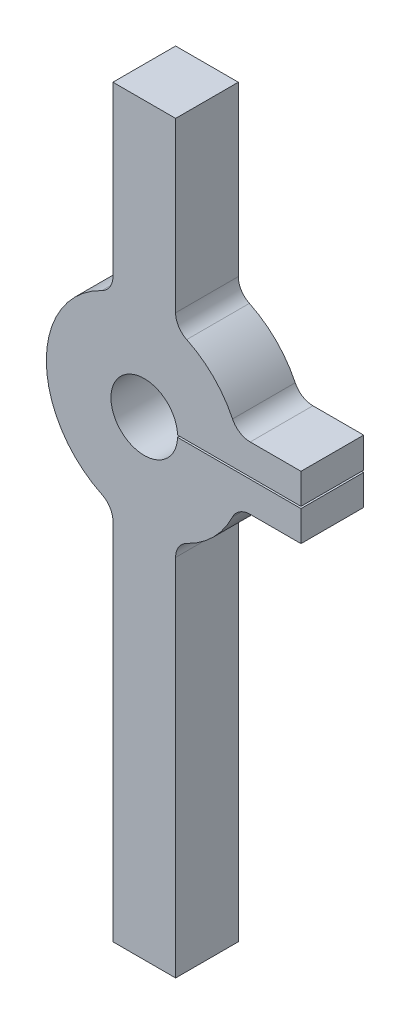
ISO-10303-21;
HEADER;
FILE_DESCRIPTION(('STEP AP214'),'2;1');
FILE_NAME('part.step','',(''),(''),'','','');
FILE_SCHEMA(('AUTOMOTIVE_DESIGN { 1 0 10303 214 1 1 1 1 }'));
ENDSEC;
DATA;
#1=APPLICATION_CONTEXT('core data for automotive mechanical design processes');
#2=APPLICATION_PROTOCOL_DEFINITION('international standard','automotive_design',2000,#1);
#3=PRODUCT_CONTEXT('',#1,'mechanical');
#4=PRODUCT('Part','Part','',(#3));
#5=PRODUCT_RELATED_PRODUCT_CATEGORY('part','',(#4));
#6=PRODUCT_DEFINITION_FORMATION('','',#4);
#7=PRODUCT_DEFINITION_CONTEXT('part definition',#1,'design');
#8=PRODUCT_DEFINITION('design','',#6,#7);
#9=PRODUCT_DEFINITION_SHAPE('','',#8);
#10=(LENGTH_UNIT() NAMED_UNIT(*) SI_UNIT(.MILLI.,.METRE.));
#11=(NAMED_UNIT(*) PLANE_ANGLE_UNIT() SI_UNIT($,.RADIAN.));
#12=(NAMED_UNIT(*) SI_UNIT($,.STERADIAN.) SOLID_ANGLE_UNIT());
#13=UNCERTAINTY_MEASURE_WITH_UNIT(LENGTH_MEASURE(1.E-05),#10,'distance_accuracy_value','');
#14=(GEOMETRIC_REPRESENTATION_CONTEXT(3) GLOBAL_UNCERTAINTY_ASSIGNED_CONTEXT((#13)) GLOBAL_UNIT_ASSIGNED_CONTEXT((#10,
#11,#12)) REPRESENTATION_CONTEXT('',''));
#15=CARTESIAN_POINT('',(0.,0.,0.));
#16=DIRECTION('',(0.,0.,1.));
#17=DIRECTION('',(1.,0.,0.));
#18=AXIS2_PLACEMENT_3D('',#15,#16,#17);
#19=CARTESIAN_POINT('',(0.,0.,-8.));
#20=DIRECTION('',(0.,0.,1.));
#21=DIRECTION('',(1.,0.,0.));
#22=AXIS2_PLACEMENT_3D('',#19,#20,#21);
#23=PLANE('',#22);
#24=CARTESIAN_POINT('',(0.,0.,-8.));
#25=DIRECTION('',(0.,0.,1.));
#26=DIRECTION('',(1.,0.,0.));
#27=AXIS2_PLACEMENT_3D('',#24,#25,#26);
#28=CIRCLE('',#27,14.);
#29=CARTESIAN_POINT('',(13.9977676791694,0.25,-8.));
#30=VERTEX_POINT('',#29);
#31=CARTESIAN_POINT('',(13.9977676791694,-0.25,-8.));
#32=VERTEX_POINT('',#31);
#33=EDGE_CURVE('E47',#30,#32,#28,.T.);
#34=ORIENTED_EDGE('',*,*,#33,.T.);
#35=DIRECTION('',(1.,0.,0.));
#36=VECTOR('',#35,1.);
#37=CARTESIAN_POINT('',(2.,-0.25,-8.));
#38=LINE('',#37,#36);
#39=CARTESIAN_POINT('',(40.,-0.25,-8.));
#40=VERTEX_POINT('',#39);
#41=EDGE_CURVE('E205',#32,#40,#38,.T.);
#42=ORIENTED_EDGE('',*,*,#41,.T.);
#43=DIRECTION('',(0.,1.,0.));
#44=VECTOR('',#43,1.);
#45=CARTESIAN_POINT('',(40.,-8.,-8.));
#46=LINE('',#45,#44);
#47=CARTESIAN_POINT('',(40.,-8.,-8.));
#48=VERTEX_POINT('',#47);
#49=EDGE_CURVE('E238',#48,#40,#46,.T.);
#50=ORIENTED_EDGE('',*,*,#49,.F.);
#51=DIRECTION('',(1.,0.,0.));
#52=VECTOR('',#51,1.);
#53=CARTESIAN_POINT('',(40.,-8.,-8.));
#54=LINE('',#53,#52);
#55=CARTESIAN_POINT('',(27.0370116691916,-8.,-8.));
#56=VERTEX_POINT('',#55);
#57=EDGE_CURVE('E224',#56,#48,#54,.T.);
#58=ORIENTED_EDGE('',*,*,#57,.F.);
#59=CARTESIAN_POINT('',(27.0370116691916,-13.,-8.));
#60=DIRECTION('',(0.,0.,1.));
#61=DIRECTION('',(1.,0.,0.));
#62=AXIS2_PLACEMENT_3D('',#59,#60,#61);
#63=CIRCLE('',#62,5.);
#64=CARTESIAN_POINT('',(22.5308430576596,-10.8333333333333,-8.));
#65=VERTEX_POINT('',#64);
#66=EDGE_CURVE('E333',#56,#65,#63,.T.);
#67=ORIENTED_EDGE('',*,*,#66,.T.);
#68=CARTESIAN_POINT('',(0.,0.,-8.));
#69=DIRECTION('',(0.,0.,1.));
#70=DIRECTION('',(1.,0.,0.));
#71=AXIS2_PLACEMENT_3D('',#68,#69,#70);
#72=CIRCLE('',#71,25.);
#73=CARTESIAN_POINT('',(10.8333333333333,-22.5308430576596,-8.));
#74=VERTEX_POINT('',#73);
#75=EDGE_CURVE('E298',#74,#65,#72,.T.);
#76=ORIENTED_EDGE('',*,*,#75,.F.);
#77=CARTESIAN_POINT('',(13.,-27.0370116691916,-8.));
#78=DIRECTION('',(0.,0.,1.));
#79=DIRECTION('',(1.,0.,0.));
#80=AXIS2_PLACEMENT_3D('',#77,#78,#79);
#81=CIRCLE('',#80,5.);
#82=CARTESIAN_POINT('',(8.00000000000001,-27.0370116691915,-8.));
#83=VERTEX_POINT('',#82);
#84=EDGE_CURVE('E345',#74,#83,#81,.T.);
#85=ORIENTED_EDGE('',*,*,#84,.T.);
#86=DIRECTION('',(0.,1.,0.));
#87=VECTOR('',#86,1.);
#88=CARTESIAN_POINT('',(8.00000000000001,-120.,-8.));
#89=LINE('',#88,#87);
#90=CARTESIAN_POINT('',(8.00000000000001,-120.,-8.));
#91=VERTEX_POINT('',#90);
#92=EDGE_CURVE('E247',#91,#83,#89,.T.);
#93=ORIENTED_EDGE('',*,*,#92,.F.);
#94=DIRECTION('',(1.,0.,0.));
#95=VECTOR('',#94,1.);
#96=CARTESIAN_POINT('',(-7.99999999999999,-120.,-8.));
#97=LINE('',#96,#95);
#98=CARTESIAN_POINT('',(-7.99999999999999,-120.,-8.));
#99=VERTEX_POINT('',#98);
#100=EDGE_CURVE('E252',#99,#91,#97,.T.);
#101=ORIENTED_EDGE('',*,*,#100,.F.);
#102=DIRECTION('',(0.,-1.,0.));
#103=VECTOR('',#102,1.);
#104=CARTESIAN_POINT('',(-7.99999999999999,-120.,-8.));
#105=LINE('',#104,#103);
#106=CARTESIAN_POINT('',(-8.,-27.0370116691915,-8.));
#107=VERTEX_POINT('',#106);
#108=EDGE_CURVE('E259',#107,#99,#105,.T.);
#109=ORIENTED_EDGE('',*,*,#108,.F.);
#110=CARTESIAN_POINT('',(-13.,-27.0370116691916,-8.));
#111=DIRECTION('',(0.,0.,1.));
#112=DIRECTION('',(1.,0.,0.));
#113=AXIS2_PLACEMENT_3D('',#110,#111,#112);
#114=CIRCLE('',#113,5.);
#115=CARTESIAN_POINT('',(-10.8333333333333,-22.5308430576596,-8.));
#116=VERTEX_POINT('',#115);
#117=EDGE_CURVE('E337',#107,#116,#114,.T.);
#118=ORIENTED_EDGE('',*,*,#117,.T.);
#119=CARTESIAN_POINT('',(-10.8333333333333,22.5308430576596,-8.));
#120=VERTEX_POINT('',#119);
#121=EDGE_CURVE('E294',#120,#116,#72,.T.);
#122=ORIENTED_EDGE('',*,*,#121,.F.);
#123=CARTESIAN_POINT('',(-13.,27.0370116691916,-8.));
#124=DIRECTION('',(0.,0.,1.));
#125=DIRECTION('',(1.,0.,0.));
#126=AXIS2_PLACEMENT_3D('',#123,#124,#125);
#127=CIRCLE('',#126,5.);
#128=CARTESIAN_POINT('',(-7.99999999999999,27.0370116691916,-8.));
#129=VERTEX_POINT('',#128);
#130=EDGE_CURVE('E341',#120,#129,#127,.T.);
#131=ORIENTED_EDGE('',*,*,#130,.T.);
#132=DIRECTION('',(0.,-1.,0.));
#133=VECTOR('',#132,1.);
#134=CARTESIAN_POINT('',(-8.,70.,-8.));
#135=LINE('',#134,#133);
#136=CARTESIAN_POINT('',(-8.,70.,-8.));
#137=VERTEX_POINT('',#136);
#138=EDGE_CURVE('E271',#137,#129,#135,.T.);
#139=ORIENTED_EDGE('',*,*,#138,.F.);
#140=DIRECTION('',(-1.,0.,0.));
#141=VECTOR('',#140,1.);
#142=CARTESIAN_POINT('',(-8.,70.,-8.));
#143=LINE('',#142,#141);
#144=CARTESIAN_POINT('',(8.,70.,-8.));
#145=VERTEX_POINT('',#144);
#146=EDGE_CURVE('E278',#145,#137,#143,.T.);
#147=ORIENTED_EDGE('',*,*,#146,.F.);
#148=DIRECTION('',(0.,1.,0.));
#149=VECTOR('',#148,1.);
#150=CARTESIAN_POINT('',(8.,70.,-8.));
#151=LINE('',#150,#149);
#152=CARTESIAN_POINT('',(7.99999999999999,27.0370116691916,-8.));
#153=VERTEX_POINT('',#152);
#154=EDGE_CURVE('E267',#153,#145,#151,.T.);
#155=ORIENTED_EDGE('',*,*,#154,.F.);
#156=CARTESIAN_POINT('',(13.,27.0370116691916,-8.));
#157=DIRECTION('',(0.,0.,1.));
#158=DIRECTION('',(1.,0.,0.));
#159=AXIS2_PLACEMENT_3D('',#156,#157,#158);
#160=CIRCLE('',#159,5.);
#161=CARTESIAN_POINT('',(10.8333333333333,22.5308430576596,-8.));
#162=VERTEX_POINT('',#161);
#163=EDGE_CURVE('E353',#153,#162,#160,.T.);
#164=ORIENTED_EDGE('',*,*,#163,.T.);
#165=CARTESIAN_POINT('',(22.5308430576596,10.8333333333333,-8.));
#166=VERTEX_POINT('',#165);
#167=EDGE_CURVE('E290',#166,#162,#72,.T.);
#168=ORIENTED_EDGE('',*,*,#167,.F.);
#169=CARTESIAN_POINT('',(27.0370116691916,13.,-8.));
#170=DIRECTION('',(0.,0.,1.));
#171=DIRECTION('',(1.,0.,0.));
#172=AXIS2_PLACEMENT_3D('',#169,#170,#171);
#173=CIRCLE('',#172,5.);
#174=CARTESIAN_POINT('',(27.0370116691916,8.,-8.));
#175=VERTEX_POINT('',#174);
#176=EDGE_CURVE('E349',#166,#175,#173,.T.);
#177=ORIENTED_EDGE('',*,*,#176,.T.);
#178=DIRECTION('',(-1.,0.,0.));
#179=VECTOR('',#178,1.);
#180=CARTESIAN_POINT('',(40.,8.,-8.));
#181=LINE('',#180,#179);
#182=CARTESIAN_POINT('',(40.,8.,-8.));
#183=VERTEX_POINT('',#182);
#184=EDGE_CURVE('E228',#183,#175,#181,.T.);
#185=ORIENTED_EDGE('',*,*,#184,.F.);
#186=CARTESIAN_POINT('',(40.,0.25,-8.));
#187=VERTEX_POINT('',#186);
#188=EDGE_CURVE('E237',#187,#183,#46,.T.);
#189=ORIENTED_EDGE('',*,*,#188,.F.);
#190=DIRECTION('',(-1.,0.,0.));
#191=VECTOR('',#190,1.);
#192=CARTESIAN_POINT('',(2.,0.25,-8.));
#193=LINE('',#192,#191);
#194=EDGE_CURVE('E208',#187,#30,#193,.T.);
#195=ORIENTED_EDGE('',*,*,#194,.T.);
#196=EDGE_LOOP('',(#34,#42,#50,#58,#67,#76,#85,#93,#101,#109,#118,#122,#131,#139,#147,#155,#164,
#168,#177,#185,#189,#195));
#197=FACE_BOUND('',#196,.T.);
#198=ADVANCED_FACE('F32',(#197),#23,.F.);
#199=CARTESIAN_POINT('',(0.,0.,8.));
#200=DIRECTION('',(0.,0.,-1.));
#201=DIRECTION('',(-1.,0.,0.));
#202=AXIS2_PLACEMENT_3D('',#199,#200,#201);
#203=CYLINDRICAL_SURFACE('',#202,8.5);
#204=DIRECTION('',(0.,0.,-1.));
#205=VECTOR('',#204,1.);
#206=CARTESIAN_POINT('',(8.49632273398321,-0.25,8.));
#207=LINE('',#206,#205);
#208=CARTESIAN_POINT('',(8.49632273398321,-0.25,-5.));
#209=VERTEX_POINT('',#208);
#210=CARTESIAN_POINT('',(8.49632273398321,-0.25,8.));
#211=VERTEX_POINT('',#210);
#212=EDGE_CURVE('E214',#209,#211,#207,.F.);
#213=ORIENTED_EDGE('',*,*,#212,.F.);
#214=CARTESIAN_POINT('',(0.,0.,-5.));
#215=DIRECTION('',(0.,0.,1.));
#216=DIRECTION('',(1.,0.,0.));
#217=AXIS2_PLACEMENT_3D('',#214,#215,#216);
#218=CIRCLE('',#217,8.5);
#219=CARTESIAN_POINT('',(8.49632273398321,0.25,-5.));
#220=VERTEX_POINT('',#219);
#221=EDGE_CURVE('E200',#220,#209,#218,.T.);
#222=ORIENTED_EDGE('',*,*,#221,.F.);
#223=DIRECTION('',(0.,0.,-1.));
#224=VECTOR('',#223,1.);
#225=CARTESIAN_POINT('',(8.49632273398321,0.25,8.));
#226=LINE('',#225,#224);
#227=CARTESIAN_POINT('',(8.49632273398321,0.25,8.));
#228=VERTEX_POINT('',#227);
#229=EDGE_CURVE('E216',#228,#220,#226,.T.);
#230=ORIENTED_EDGE('',*,*,#229,.F.);
#231=CARTESIAN_POINT('',(0.,0.,8.));
#232=DIRECTION('',(0.,0.,1.));
#233=DIRECTION('',(1.,0.,0.));
#234=AXIS2_PLACEMENT_3D('',#231,#232,#233);
#235=CIRCLE('',#234,8.5);
#236=EDGE_CURVE('E287',#228,#211,#235,.T.);
#237=ORIENTED_EDGE('',*,*,#236,.T.);
#238=EDGE_LOOP('',(#213,#222,#230,#237));
#239=FACE_BOUND('',#238,.T.);
#240=ADVANCED_FACE('F368',(#239),#203,.F.);
#241=CARTESIAN_POINT('',(2.,-0.25,-8.));
#242=DIRECTION('',(0.,-1.,0.));
#243=DIRECTION('',(0.,0.,-1.));
#244=AXIS2_PLACEMENT_3D('',#241,#242,#243);
#245=PLANE('',#244);
#246=DIRECTION('',(1.,0.,0.));
#247=VECTOR('',#246,1.);
#248=CARTESIAN_POINT('',(2.,-0.25,-5.));
#249=LINE('',#248,#247);
#250=CARTESIAN_POINT('',(13.9977676791694,-0.25,-5.));
#251=VERTEX_POINT('',#250);
#252=EDGE_CURVE('E199',#209,#251,#249,.T.);
#253=ORIENTED_EDGE('',*,*,#252,.F.);
#254=ORIENTED_EDGE('',*,*,#212,.T.);
#255=DIRECTION('',(1.,0.,0.));
#256=VECTOR('',#255,1.);
#257=CARTESIAN_POINT('',(2.,-0.25,8.));
#258=LINE('',#257,#256);
#259=CARTESIAN_POINT('',(40.,-0.25,8.));
#260=VERTEX_POINT('',#259);
#261=EDGE_CURVE('E218',#211,#260,#258,.T.);
#262=ORIENTED_EDGE('',*,*,#261,.T.);
#263=DIRECTION('',(0.,0.,1.));
#264=VECTOR('',#263,1.);
#265=CARTESIAN_POINT('',(40.,-0.25,8.));
#266=LINE('',#265,#264);
#267=EDGE_CURVE('E212',#40,#260,#266,.T.);
#268=ORIENTED_EDGE('',*,*,#267,.F.);
#269=ORIENTED_EDGE('',*,*,#41,.F.);
#270=DIRECTION('',(0.,0.,1.));
#271=VECTOR('',#270,1.);
#272=CARTESIAN_POINT('',(13.9977676791694,-0.25,0.));
#273=LINE('',#272,#271);
#274=EDGE_CURVE('E192',#251,#32,#273,.F.);
#275=ORIENTED_EDGE('',*,*,#274,.F.);
#276=EDGE_LOOP('',(#253,#254,#262,#268,#269,#275));
#277=FACE_BOUND('',#276,.T.);
#278=ADVANCED_FACE('F210',(#277),#245,.F.);
#279=CARTESIAN_POINT('',(2.,0.25,-8.));
#280=DIRECTION('',(0.,1.,0.));
#281=DIRECTION('',(0.,0.,1.));
#282=AXIS2_PLACEMENT_3D('',#279,#280,#281);
#283=PLANE('',#282);
#284=DIRECTION('',(-1.,0.,0.));
#285=VECTOR('',#284,1.);
#286=CARTESIAN_POINT('',(2.,0.25,-5.));
#287=LINE('',#286,#285);
#288=CARTESIAN_POINT('',(13.9977676791694,0.25,-5.));
#289=VERTEX_POINT('',#288);
#290=EDGE_CURVE('E11',#289,#220,#287,.T.);
#291=ORIENTED_EDGE('',*,*,#290,.F.);
#292=DIRECTION('',(0.,0.,1.));
#293=VECTOR('',#292,1.);
#294=CARTESIAN_POINT('',(13.9977676791694,0.25,0.));
#295=LINE('',#294,#293);
#296=EDGE_CURVE('E40',#30,#289,#295,.T.);
#297=ORIENTED_EDGE('',*,*,#296,.F.);
#298=ORIENTED_EDGE('',*,*,#194,.F.);
#299=DIRECTION('',(0.,0.,-1.));
#300=VECTOR('',#299,1.);
#301=CARTESIAN_POINT('',(40.,0.25,8.));
#302=LINE('',#301,#300);
#303=CARTESIAN_POINT('',(40.,0.25,8.));
#304=VERTEX_POINT('',#303);
#305=EDGE_CURVE('E300',#304,#187,#302,.T.);
#306=ORIENTED_EDGE('',*,*,#305,.F.);
#307=DIRECTION('',(-1.,0.,0.));
#308=VECTOR('',#307,1.);
#309=CARTESIAN_POINT('',(2.,0.25,8.));
#310=LINE('',#309,#308);
#311=EDGE_CURVE('E364',#304,#228,#310,.T.);
#312=ORIENTED_EDGE('',*,*,#311,.T.);
#313=ORIENTED_EDGE('',*,*,#229,.T.);
#314=EDGE_LOOP('',(#291,#297,#298,#306,#312,#313));
#315=FACE_BOUND('',#314,.T.);
#316=ADVANCED_FACE('F361',(#315),#283,.F.);
#317=CARTESIAN_POINT('',(40.,-8.,8.));
#318=DIRECTION('',(-1.,0.,0.));
#319=DIRECTION('',(0.,0.,1.));
#320=AXIS2_PLACEMENT_3D('',#317,#318,#319);
#321=PLANE('',#320);
#322=DIRECTION('',(0.,1.,0.));
#323=VECTOR('',#322,1.);
#324=CARTESIAN_POINT('',(40.,-8.,8.));
#325=LINE('',#324,#323);
#326=CARTESIAN_POINT('',(40.,8.,8.));
#327=VERTEX_POINT('',#326);
#328=EDGE_CURVE('E227',#304,#327,#325,.T.);
#329=ORIENTED_EDGE('',*,*,#328,.F.);
#330=ORIENTED_EDGE('',*,*,#305,.T.);
#331=ORIENTED_EDGE('',*,*,#188,.T.);
#332=DIRECTION('',(0.,0.,-1.));
#333=VECTOR('',#332,1.);
#334=CARTESIAN_POINT('',(40.,8.,8.));
#335=LINE('',#334,#333);
#336=EDGE_CURVE('E235',#327,#183,#335,.T.);
#337=ORIENTED_EDGE('',*,*,#336,.F.);
#338=EDGE_LOOP('',(#329,#330,#331,#337));
#339=FACE_BOUND('',#338,.T.);
#340=ADVANCED_FACE('F455',(#339),#321,.F.);
#341=CARTESIAN_POINT('',(0.,0.,8.));
#342=DIRECTION('',(0.,0.,-1.));
#343=DIRECTION('',(-1.,0.,0.));
#344=AXIS2_PLACEMENT_3D('',#341,#342,#343);
#345=CYLINDRICAL_SURFACE('',#344,25.);
#346=ORIENTED_EDGE('',*,*,#75,.T.);
#347=DIRECTION('',(0.,0.,-1.));
#348=VECTOR('',#347,1.);
#349=CARTESIAN_POINT('',(22.5308430576596,-10.8333333333333,8.));
#350=LINE('',#349,#348);
#351=CARTESIAN_POINT('',(22.5308430576596,-10.8333333333333,8.));
#352=VERTEX_POINT('',#351);
#353=EDGE_CURVE('E309',#65,#352,#350,.F.);
#354=ORIENTED_EDGE('',*,*,#353,.T.);
#355=CARTESIAN_POINT('',(0.,0.,8.));
#356=DIRECTION('',(0.,0.,1.));
#357=DIRECTION('',(1.,0.,0.));
#358=AXIS2_PLACEMENT_3D('',#355,#356,#357);
#359=CIRCLE('',#358,25.);
#360=CARTESIAN_POINT('',(10.8333333333333,-22.5308430576596,8.));
#361=VERTEX_POINT('',#360);
#362=EDGE_CURVE('E293',#361,#352,#359,.T.);
#363=ORIENTED_EDGE('',*,*,#362,.F.);
#364=DIRECTION('',(0.,0.,-1.));
#365=VECTOR('',#364,1.);
#366=CARTESIAN_POINT('',(10.8333333333333,-22.5308430576596,8.));
#367=LINE('',#366,#365);
#368=EDGE_CURVE('E306',#361,#74,#367,.T.);
#369=ORIENTED_EDGE('',*,*,#368,.T.);
#370=EDGE_LOOP('',(#346,#354,#363,#369));
#371=FACE_BOUND('',#370,.T.);
#372=ADVANCED_FACE('F393',(#371),#345,.T.);
#373=CARTESIAN_POINT('',(22.5308430576596,10.8333333333333,8.));
#374=VERTEX_POINT('',#373);
#375=CARTESIAN_POINT('',(10.8333333333333,22.5308430576596,8.));
#376=VERTEX_POINT('',#375);
#377=EDGE_CURVE('E291',#374,#376,#359,.T.);
#378=ORIENTED_EDGE('',*,*,#377,.F.);
#379=DIRECTION('',(0.,0.,-1.));
#380=VECTOR('',#379,1.);
#381=CARTESIAN_POINT('',(22.5308430576596,10.8333333333333,8.));
#382=LINE('',#381,#380);
#383=EDGE_CURVE('E325',#374,#166,#382,.T.);
#384=ORIENTED_EDGE('',*,*,#383,.T.);
#385=ORIENTED_EDGE('',*,*,#167,.T.);
#386=DIRECTION('',(0.,0.,-1.));
#387=VECTOR('',#386,1.);
#388=CARTESIAN_POINT('',(10.8333333333333,22.5308430576596,8.));
#389=LINE('',#388,#387);
#390=EDGE_CURVE('E323',#162,#376,#389,.F.);
#391=ORIENTED_EDGE('',*,*,#390,.T.);
#392=EDGE_LOOP('',(#378,#384,#385,#391));
#393=FACE_BOUND('',#392,.T.);
#394=ADVANCED_FACE('F454',(#393),#345,.T.);
#395=ORIENTED_EDGE('',*,*,#121,.T.);
#396=DIRECTION('',(0.,0.,-1.));
#397=VECTOR('',#396,1.);
#398=CARTESIAN_POINT('',(-10.8333333333333,-22.5308430576596,8.));
#399=LINE('',#398,#397);
#400=CARTESIAN_POINT('',(-10.8333333333333,-22.5308430576596,8.));
#401=VERTEX_POINT('',#400);
#402=EDGE_CURVE('E317',#116,#401,#399,.F.);
#403=ORIENTED_EDGE('',*,*,#402,.T.);
#404=CARTESIAN_POINT('',(-10.8333333333333,22.5308430576596,8.));
#405=VERTEX_POINT('',#404);
#406=EDGE_CURVE('E295',#405,#401,#359,.T.);
#407=ORIENTED_EDGE('',*,*,#406,.F.);
#408=DIRECTION('',(0.,0.,-1.));
#409=VECTOR('',#408,1.);
#410=CARTESIAN_POINT('',(-10.8333333333333,22.5308430576596,8.));
#411=LINE('',#410,#409);
#412=EDGE_CURVE('E314',#405,#120,#411,.T.);
#413=ORIENTED_EDGE('',*,*,#412,.T.);
#414=EDGE_LOOP('',(#395,#403,#407,#413));
#415=FACE_BOUND('',#414,.T.);
#416=ADVANCED_FACE('F425',(#415),#345,.T.);
#417=CARTESIAN_POINT('',(0.,0.,8.));
#418=DIRECTION('',(0.,0.,1.));
#419=DIRECTION('',(1.,0.,0.));
#420=AXIS2_PLACEMENT_3D('',#417,#418,#419);
#421=PLANE('',#420);
#422=ORIENTED_EDGE('',*,*,#311,.F.);
#423=ORIENTED_EDGE('',*,*,#328,.T.);
#424=DIRECTION('',(-1.,0.,0.));
#425=VECTOR('',#424,1.);
#426=CARTESIAN_POINT('',(40.,8.,8.));
#427=LINE('',#426,#425);
#428=CARTESIAN_POINT('',(27.0370116691916,8.,8.));
#429=VERTEX_POINT('',#428);
#430=EDGE_CURVE('E232',#327,#429,#427,.T.);
#431=ORIENTED_EDGE('',*,*,#430,.T.);
#432=CARTESIAN_POINT('',(27.0370116691916,13.,8.));
#433=DIRECTION('',(0.,0.,1.));
#434=DIRECTION('',(1.,0.,0.));
#435=AXIS2_PLACEMENT_3D('',#432,#433,#434);
#436=CIRCLE('',#435,5.);
#437=EDGE_CURVE('E351',#429,#374,#436,.F.);
#438=ORIENTED_EDGE('',*,*,#437,.T.);
#439=ORIENTED_EDGE('',*,*,#377,.T.);
#440=CARTESIAN_POINT('',(13.,27.0370116691916,8.));
#441=DIRECTION('',(0.,0.,1.));
#442=DIRECTION('',(1.,0.,0.));
#443=AXIS2_PLACEMENT_3D('',#440,#441,#442);
#444=CIRCLE('',#443,5.);
#445=CARTESIAN_POINT('',(7.99999999999999,27.0370116691916,8.));
#446=VERTEX_POINT('',#445);
#447=EDGE_CURVE('E55',#376,#446,#444,.F.);
#448=ORIENTED_EDGE('',*,*,#447,.T.);
#449=DIRECTION('',(0.,1.,0.));
#450=VECTOR('',#449,1.);
#451=CARTESIAN_POINT('',(8.,70.,8.));
#452=LINE('',#451,#450);
#453=CARTESIAN_POINT('',(8.,70.,8.));
#454=VERTEX_POINT('',#453);
#455=EDGE_CURVE('E268',#446,#454,#452,.T.);
#456=ORIENTED_EDGE('',*,*,#455,.T.);
#457=DIRECTION('',(-1.,0.,0.));
#458=VECTOR('',#457,1.);
#459=CARTESIAN_POINT('',(-8.,70.,8.));
#460=LINE('',#459,#458);
#461=CARTESIAN_POINT('',(-8.,70.,8.));
#462=VERTEX_POINT('',#461);
#463=EDGE_CURVE('E270',#454,#462,#460,.T.);
#464=ORIENTED_EDGE('',*,*,#463,.T.);
#465=DIRECTION('',(0.,-1.,0.));
#466=VECTOR('',#465,1.);
#467=CARTESIAN_POINT('',(-8.,70.,8.));
#468=LINE('',#467,#466);
#469=CARTESIAN_POINT('',(-7.99999999999999,27.0370116691916,8.));
#470=VERTEX_POINT('',#469);
#471=EDGE_CURVE('E273',#462,#470,#468,.T.);
#472=ORIENTED_EDGE('',*,*,#471,.T.);
#473=CARTESIAN_POINT('',(-13.,27.0370116691916,8.));
#474=DIRECTION('',(0.,0.,1.));
#475=DIRECTION('',(1.,0.,0.));
#476=AXIS2_PLACEMENT_3D('',#473,#474,#475);
#477=CIRCLE('',#476,5.);
#478=EDGE_CURVE('E343',#470,#405,#477,.F.);
#479=ORIENTED_EDGE('',*,*,#478,.T.);
#480=ORIENTED_EDGE('',*,*,#406,.T.);
#481=CARTESIAN_POINT('',(-13.,-27.0370116691916,8.));
#482=DIRECTION('',(0.,0.,1.));
#483=DIRECTION('',(1.,0.,0.));
#484=AXIS2_PLACEMENT_3D('',#481,#482,#483);
#485=CIRCLE('',#484,5.);
#486=CARTESIAN_POINT('',(-8.,-27.0370116691915,8.));
#487=VERTEX_POINT('',#486);
#488=EDGE_CURVE('E339',#401,#487,#485,.F.);
#489=ORIENTED_EDGE('',*,*,#488,.T.);
#490=DIRECTION('',(0.,-1.,0.));
#491=VECTOR('',#490,1.);
#492=CARTESIAN_POINT('',(-7.99999999999999,-120.,8.));
#493=LINE('',#492,#491);
#494=CARTESIAN_POINT('',(-7.99999999999999,-120.,8.));
#495=VERTEX_POINT('',#494);
#496=EDGE_CURVE('E251',#487,#495,#493,.T.);
#497=ORIENTED_EDGE('',*,*,#496,.T.);
#498=DIRECTION('',(1.,0.,0.));
#499=VECTOR('',#498,1.);
#500=CARTESIAN_POINT('',(-7.99999999999999,-120.,8.));
#501=LINE('',#500,#499);
#502=CARTESIAN_POINT('',(8.00000000000001,-120.,8.));
#503=VERTEX_POINT('',#502);
#504=EDGE_CURVE('E254',#495,#503,#501,.T.);
#505=ORIENTED_EDGE('',*,*,#504,.T.);
#506=DIRECTION('',(0.,1.,0.));
#507=VECTOR('',#506,1.);
#508=CARTESIAN_POINT('',(8.00000000000001,-120.,8.));
#509=LINE('',#508,#507);
#510=CARTESIAN_POINT('',(8.00000000000001,-27.0370116691915,8.));
#511=VERTEX_POINT('',#510);
#512=EDGE_CURVE('E248',#503,#511,#509,.T.);
#513=ORIENTED_EDGE('',*,*,#512,.T.);
#514=CARTESIAN_POINT('',(13.,-27.0370116691916,8.));
#515=DIRECTION('',(0.,0.,1.));
#516=DIRECTION('',(1.,0.,0.));
#517=AXIS2_PLACEMENT_3D('',#514,#515,#516);
#518=CIRCLE('',#517,5.);
#519=EDGE_CURVE('E347',#511,#361,#518,.F.);
#520=ORIENTED_EDGE('',*,*,#519,.T.);
#521=ORIENTED_EDGE('',*,*,#362,.T.);
#522=CARTESIAN_POINT('',(27.0370116691916,-13.,8.));
#523=DIRECTION('',(0.,0.,1.));
#524=DIRECTION('',(1.,0.,0.));
#525=AXIS2_PLACEMENT_3D('',#522,#523,#524);
#526=CIRCLE('',#525,5.);
#527=CARTESIAN_POINT('',(27.0370116691916,-8.,8.));
#528=VERTEX_POINT('',#527);
#529=EDGE_CURVE('E335',#352,#528,#526,.F.);
#530=ORIENTED_EDGE('',*,*,#529,.T.);
#531=DIRECTION('',(1.,0.,0.));
#532=VECTOR('',#531,1.);
#533=CARTESIAN_POINT('',(40.,-8.,8.));
#534=LINE('',#533,#532);
#535=CARTESIAN_POINT('',(40.,-8.,8.));
#536=VERTEX_POINT('',#535);
#537=EDGE_CURVE('E225',#528,#536,#534,.T.);
#538=ORIENTED_EDGE('',*,*,#537,.T.);
#539=EDGE_CURVE('E229',#536,#260,#325,.T.);
#540=ORIENTED_EDGE('',*,*,#539,.T.);
#541=ORIENTED_EDGE('',*,*,#261,.F.);
#542=ORIENTED_EDGE('',*,*,#236,.F.);
#543=EDGE_LOOP('',(#422,#423,#431,#438,#439,#448,#456,#464,#472,#479,#480,#489,#497,#505,#513,
#520,#521,#530,#538,#540,#541,#542));
#544=FACE_BOUND('',#543,.T.);
#545=ADVANCED_FACE('F370',(#544),#421,.T.);
#546=CARTESIAN_POINT('',(8.,70.,8.));
#547=DIRECTION('',(-1.,0.,0.));
#548=DIRECTION('',(0.,-1.,0.));
#549=AXIS2_PLACEMENT_3D('',#546,#547,#548);
#550=PLANE('',#549);
#551=ORIENTED_EDGE('',*,*,#455,.F.);
#552=DIRECTION('',(0.,0.,1.));
#553=VECTOR('',#552,1.);
#554=CARTESIAN_POINT('',(7.99999999999999,27.0370116691916,-8.));
#555=LINE('',#554,#553);
#556=EDGE_CURVE('E330',#446,#153,#555,.F.);
#557=ORIENTED_EDGE('',*,*,#556,.T.);
#558=ORIENTED_EDGE('',*,*,#154,.T.);
#559=DIRECTION('',(0.,0.,-1.));
#560=VECTOR('',#559,1.);
#561=CARTESIAN_POINT('',(8.,70.,8.));
#562=LINE('',#561,#560);
#563=EDGE_CURVE('E284',#454,#145,#562,.T.);
#564=ORIENTED_EDGE('',*,*,#563,.F.);
#565=EDGE_LOOP('',(#551,#557,#558,#564));
#566=FACE_BOUND('',#565,.T.);
#567=ADVANCED_FACE('F483',(#566),#550,.F.);
#568=CARTESIAN_POINT('',(-8.,70.,8.));
#569=DIRECTION('',(0.,-1.,0.));
#570=DIRECTION('',(0.,0.,-1.));
#571=AXIS2_PLACEMENT_3D('',#568,#569,#570);
#572=PLANE('',#571);
#573=ORIENTED_EDGE('',*,*,#146,.T.);
#574=DIRECTION('',(0.,0.,-1.));
#575=VECTOR('',#574,1.);
#576=CARTESIAN_POINT('',(-8.,70.,8.));
#577=LINE('',#576,#575);
#578=EDGE_CURVE('E276',#462,#137,#577,.T.);
#579=ORIENTED_EDGE('',*,*,#578,.F.);
#580=ORIENTED_EDGE('',*,*,#463,.F.);
#581=ORIENTED_EDGE('',*,*,#563,.T.);
#582=EDGE_LOOP('',(#573,#579,#580,#581));
#583=FACE_BOUND('',#582,.T.);
#584=ADVANCED_FACE('F480',(#583),#572,.F.);
#585=CARTESIAN_POINT('',(-8.,70.,8.));
#586=DIRECTION('',(1.,0.,0.));
#587=DIRECTION('',(0.,1.,0.));
#588=AXIS2_PLACEMENT_3D('',#585,#586,#587);
#589=PLANE('',#588);
#590=ORIENTED_EDGE('',*,*,#138,.T.);
#591=DIRECTION('',(0.,0.,1.));
#592=VECTOR('',#591,1.);
#593=CARTESIAN_POINT('',(-7.99999999999999,27.0370116691916,8.));
#594=LINE('',#593,#592);
#595=EDGE_CURVE('E319',#129,#470,#594,.T.);
#596=ORIENTED_EDGE('',*,*,#595,.T.);
#597=ORIENTED_EDGE('',*,*,#471,.F.);
#598=ORIENTED_EDGE('',*,*,#578,.T.);
#599=EDGE_LOOP('',(#590,#596,#597,#598));
#600=FACE_BOUND('',#599,.T.);
#601=ADVANCED_FACE('F431',(#600),#589,.F.);
#602=CARTESIAN_POINT('',(8.00000000000001,-120.,8.));
#603=DIRECTION('',(-1.,0.,0.));
#604=DIRECTION('',(0.,-1.,0.));
#605=AXIS2_PLACEMENT_3D('',#602,#603,#604);
#606=PLANE('',#605);
#607=ORIENTED_EDGE('',*,*,#92,.T.);
#608=DIRECTION('',(0.,0.,1.));
#609=VECTOR('',#608,1.);
#610=CARTESIAN_POINT('',(8.00000000000001,-27.0370116691916,8.));
#611=LINE('',#610,#609);
#612=EDGE_CURVE('E321',#83,#511,#611,.T.);
#613=ORIENTED_EDGE('',*,*,#612,.T.);
#614=ORIENTED_EDGE('',*,*,#512,.F.);
#615=DIRECTION('',(0.,0.,-1.));
#616=VECTOR('',#615,1.);
#617=CARTESIAN_POINT('',(8.00000000000001,-120.,8.));
#618=LINE('',#617,#616);
#619=EDGE_CURVE('E256',#503,#91,#618,.T.);
#620=ORIENTED_EDGE('',*,*,#619,.T.);
#621=EDGE_LOOP('',(#607,#613,#614,#620));
#622=FACE_BOUND('',#621,.T.);
#623=ADVANCED_FACE('F421',(#622),#606,.F.);
#624=CARTESIAN_POINT('',(-7.99999999999999,-120.,8.));
#625=DIRECTION('',(1.,0.,0.));
#626=DIRECTION('',(0.,1.,0.));
#627=AXIS2_PLACEMENT_3D('',#624,#625,#626);
#628=PLANE('',#627);
#629=ORIENTED_EDGE('',*,*,#496,.F.);
#630=DIRECTION('',(0.,0.,1.));
#631=VECTOR('',#630,1.);
#632=CARTESIAN_POINT('',(-8.,-27.0370116691916,-8.));
#633=LINE('',#632,#631);
#634=EDGE_CURVE('E311',#487,#107,#633,.F.);
#635=ORIENTED_EDGE('',*,*,#634,.T.);
#636=ORIENTED_EDGE('',*,*,#108,.T.);
#637=DIRECTION('',(0.,0.,-1.));
#638=VECTOR('',#637,1.);
#639=CARTESIAN_POINT('',(-7.99999999999999,-120.,8.));
#640=LINE('',#639,#638);
#641=EDGE_CURVE('E264',#495,#99,#640,.T.);
#642=ORIENTED_EDGE('',*,*,#641,.F.);
#643=EDGE_LOOP('',(#629,#635,#636,#642));
#644=FACE_BOUND('',#643,.T.);
#645=ADVANCED_FACE('F409',(#644),#628,.F.);
#646=CARTESIAN_POINT('',(-7.99999999999999,-120.,8.));
#647=DIRECTION('',(0.,1.,0.));
#648=DIRECTION('',(0.,0.,1.));
#649=AXIS2_PLACEMENT_3D('',#646,#647,#648);
#650=PLANE('',#649);
#651=ORIENTED_EDGE('',*,*,#100,.T.);
#652=ORIENTED_EDGE('',*,*,#619,.F.);
#653=ORIENTED_EDGE('',*,*,#504,.F.);
#654=ORIENTED_EDGE('',*,*,#641,.T.);
#655=EDGE_LOOP('',(#651,#652,#653,#654));
#656=FACE_BOUND('',#655,.T.);
#657=ADVANCED_FACE('F417',(#656),#650,.F.);
#658=CARTESIAN_POINT('',(40.,-8.,8.));
#659=DIRECTION('',(0.,1.,0.));
#660=DIRECTION('',(-1.,0.,0.));
#661=AXIS2_PLACEMENT_3D('',#658,#659,#660);
#662=PLANE('',#661);
#663=ORIENTED_EDGE('',*,*,#537,.F.);
#664=DIRECTION('',(0.,0.,1.));
#665=VECTOR('',#664,1.);
#666=CARTESIAN_POINT('',(27.0370116691916,-8.,-8.));
#667=LINE('',#666,#665);
#668=EDGE_CURVE('E303',#528,#56,#667,.F.);
#669=ORIENTED_EDGE('',*,*,#668,.T.);
#670=ORIENTED_EDGE('',*,*,#57,.T.);
#671=DIRECTION('',(0.,0.,-1.));
#672=VECTOR('',#671,1.);
#673=CARTESIAN_POINT('',(40.,-8.,8.));
#674=LINE('',#673,#672);
#675=EDGE_CURVE('E244',#536,#48,#674,.T.);
#676=ORIENTED_EDGE('',*,*,#675,.F.);
#677=EDGE_LOOP('',(#663,#669,#670,#676));
#678=FACE_BOUND('',#677,.T.);
#679=ADVANCED_FACE('F384',(#678),#662,.F.);
#680=ORIENTED_EDGE('',*,*,#49,.T.);
#681=ORIENTED_EDGE('',*,*,#267,.T.);
#682=ORIENTED_EDGE('',*,*,#539,.F.);
#683=ORIENTED_EDGE('',*,*,#675,.T.);
#684=EDGE_LOOP('',(#680,#681,#682,#683));
#685=FACE_BOUND('',#684,.T.);
#686=ADVANCED_FACE('F377',(#685),#321,.F.);
#687=CARTESIAN_POINT('',(40.,8.,8.));
#688=DIRECTION('',(0.,-1.,0.));
#689=DIRECTION('',(1.,0.,0.));
#690=AXIS2_PLACEMENT_3D('',#687,#688,#689);
#691=PLANE('',#690);
#692=ORIENTED_EDGE('',*,*,#184,.T.);
#693=DIRECTION('',(0.,0.,1.));
#694=VECTOR('',#693,1.);
#695=CARTESIAN_POINT('',(27.0370116691916,8.,8.));
#696=LINE('',#695,#694);
#697=EDGE_CURVE('E328',#175,#429,#696,.T.);
#698=ORIENTED_EDGE('',*,*,#697,.T.);
#699=ORIENTED_EDGE('',*,*,#430,.F.);
#700=ORIENTED_EDGE('',*,*,#336,.T.);
#701=EDGE_LOOP('',(#692,#698,#699,#700));
#702=FACE_BOUND('',#701,.T.);
#703=ADVANCED_FACE('F457',(#702),#691,.F.);
#704=CARTESIAN_POINT('',(27.0370116691916,-13.,8.));
#705=DIRECTION('',(0.,0.,-1.));
#706=DIRECTION('',(-1.,0.,0.));
#707=AXIS2_PLACEMENT_3D('',#704,#705,#706);
#708=CYLINDRICAL_SURFACE('',#707,5.);
#709=ORIENTED_EDGE('',*,*,#529,.F.);
#710=ORIENTED_EDGE('',*,*,#353,.F.);
#711=ORIENTED_EDGE('',*,*,#66,.F.);
#712=ORIENTED_EDGE('',*,*,#668,.F.);
#713=EDGE_LOOP('',(#709,#710,#711,#712));
#714=FACE_BOUND('',#713,.T.);
#715=ADVANCED_FACE('F388',(#714),#708,.F.);
#716=CARTESIAN_POINT('',(-13.,-27.0370116691916,8.));
#717=DIRECTION('',(0.,0.,-1.));
#718=DIRECTION('',(-1.,0.,0.));
#719=AXIS2_PLACEMENT_3D('',#716,#717,#718);
#720=CYLINDRICAL_SURFACE('',#719,5.);
#721=ORIENTED_EDGE('',*,*,#488,.F.);
#722=ORIENTED_EDGE('',*,*,#402,.F.);
#723=ORIENTED_EDGE('',*,*,#117,.F.);
#724=ORIENTED_EDGE('',*,*,#634,.F.);
#725=EDGE_LOOP('',(#721,#722,#723,#724));
#726=FACE_BOUND('',#725,.T.);
#727=ADVANCED_FACE('F406',(#726),#720,.F.);
#728=CARTESIAN_POINT('',(-13.,27.0370116691916,8.));
#729=DIRECTION('',(0.,0.,-1.));
#730=DIRECTION('',(-1.,0.,0.));
#731=AXIS2_PLACEMENT_3D('',#728,#729,#730);
#732=CYLINDRICAL_SURFACE('',#731,5.);
#733=ORIENTED_EDGE('',*,*,#478,.F.);
#734=ORIENTED_EDGE('',*,*,#595,.F.);
#735=ORIENTED_EDGE('',*,*,#130,.F.);
#736=ORIENTED_EDGE('',*,*,#412,.F.);
#737=EDGE_LOOP('',(#733,#734,#735,#736));
#738=FACE_BOUND('',#737,.T.);
#739=ADVANCED_FACE('F434',(#738),#732,.F.);
#740=CARTESIAN_POINT('',(13.,-27.0370116691916,8.));
#741=DIRECTION('',(0.,0.,-1.));
#742=DIRECTION('',(-1.,0.,0.));
#743=AXIS2_PLACEMENT_3D('',#740,#741,#742);
#744=CYLINDRICAL_SURFACE('',#743,5.);
#745=ORIENTED_EDGE('',*,*,#519,.F.);
#746=ORIENTED_EDGE('',*,*,#612,.F.);
#747=ORIENTED_EDGE('',*,*,#84,.F.);
#748=ORIENTED_EDGE('',*,*,#368,.F.);
#749=EDGE_LOOP('',(#745,#746,#747,#748));
#750=FACE_BOUND('',#749,.T.);
#751=ADVANCED_FACE('F424',(#750),#744,.F.);
#752=CARTESIAN_POINT('',(27.0370116691916,13.,8.));
#753=DIRECTION('',(0.,0.,-1.));
#754=DIRECTION('',(-1.,0.,0.));
#755=AXIS2_PLACEMENT_3D('',#752,#753,#754);
#756=CYLINDRICAL_SURFACE('',#755,5.);
#757=ORIENTED_EDGE('',*,*,#437,.F.);
#758=ORIENTED_EDGE('',*,*,#697,.F.);
#759=ORIENTED_EDGE('',*,*,#176,.F.);
#760=ORIENTED_EDGE('',*,*,#383,.F.);
#761=EDGE_LOOP('',(#757,#758,#759,#760));
#762=FACE_BOUND('',#761,.T.);
#763=ADVANCED_FACE('F441',(#762),#756,.F.);
#764=CARTESIAN_POINT('',(13.,27.0370116691916,8.));
#765=DIRECTION('',(0.,0.,-1.));
#766=DIRECTION('',(-1.,0.,0.));
#767=AXIS2_PLACEMENT_3D('',#764,#765,#766);
#768=CYLINDRICAL_SURFACE('',#767,5.);
#769=ORIENTED_EDGE('',*,*,#447,.F.);
#770=ORIENTED_EDGE('',*,*,#390,.F.);
#771=ORIENTED_EDGE('',*,*,#163,.F.);
#772=ORIENTED_EDGE('',*,*,#556,.F.);
#773=EDGE_LOOP('',(#769,#770,#771,#772));
#774=FACE_BOUND('',#773,.T.);
#775=ADVANCED_FACE('F34',(#774),#768,.F.);
#776=CARTESIAN_POINT('',(0.,8.5,-5.));
#777=DIRECTION('',(0.,0.,-1.));
#778=DIRECTION('',(-1.,0.,0.));
#779=AXIS2_PLACEMENT_3D('',#776,#777,#778);
#780=PLANE('',#779);
#781=ORIENTED_EDGE('',*,*,#252,.T.);
#782=CARTESIAN_POINT('',(0.,0.,-5.));
#783=DIRECTION('',(0.,0.,1.));
#784=DIRECTION('',(1.,0.,0.));
#785=AXIS2_PLACEMENT_3D('',#782,#783,#784);
#786=CIRCLE('',#785,14.);
#787=EDGE_CURVE('E195',#289,#251,#786,.T.);
#788=ORIENTED_EDGE('',*,*,#787,.F.);
#789=ORIENTED_EDGE('',*,*,#290,.T.);
#790=ORIENTED_EDGE('',*,*,#221,.T.);
#791=EDGE_LOOP('',(#781,#788,#789,#790));
#792=FACE_BOUND('',#791,.T.);
#793=ADVANCED_FACE('F358',(#792),#780,.T.);
#794=CARTESIAN_POINT('',(0.,0.,0.));
#795=DIRECTION('',(0.,0.,1.));
#796=DIRECTION('',(1.,0.,0.));
#797=AXIS2_PLACEMENT_3D('',#794,#795,#796);
#798=CYLINDRICAL_SURFACE('',#797,14.);
#799=ORIENTED_EDGE('',*,*,#274,.T.);
#800=ORIENTED_EDGE('',*,*,#33,.F.);
#801=ORIENTED_EDGE('',*,*,#296,.T.);
#802=ORIENTED_EDGE('',*,*,#787,.T.);
#803=EDGE_LOOP('',(#799,#800,#801,#802));
#804=FACE_BOUND('',#803,.T.);
#805=ADVANCED_FACE('F193',(#804),#798,.F.);
#806=CLOSED_SHELL('',(#198,#240,#278,#316,#340,#372,#394,#416,#545,#567,#584,#601,#623,#645,
#657,#679,#686,#703,#715,#727,#739,#751,#763,#775,#793,#805));
#807=MANIFOLD_SOLID_BREP('B2',#806);
#808=ADVANCED_BREP_SHAPE_REPRESENTATION('',(#18,#807),#14);
#809=SHAPE_DEFINITION_REPRESENTATION(#9,#808);
ENDSEC;
END-ISO-10303-21;
